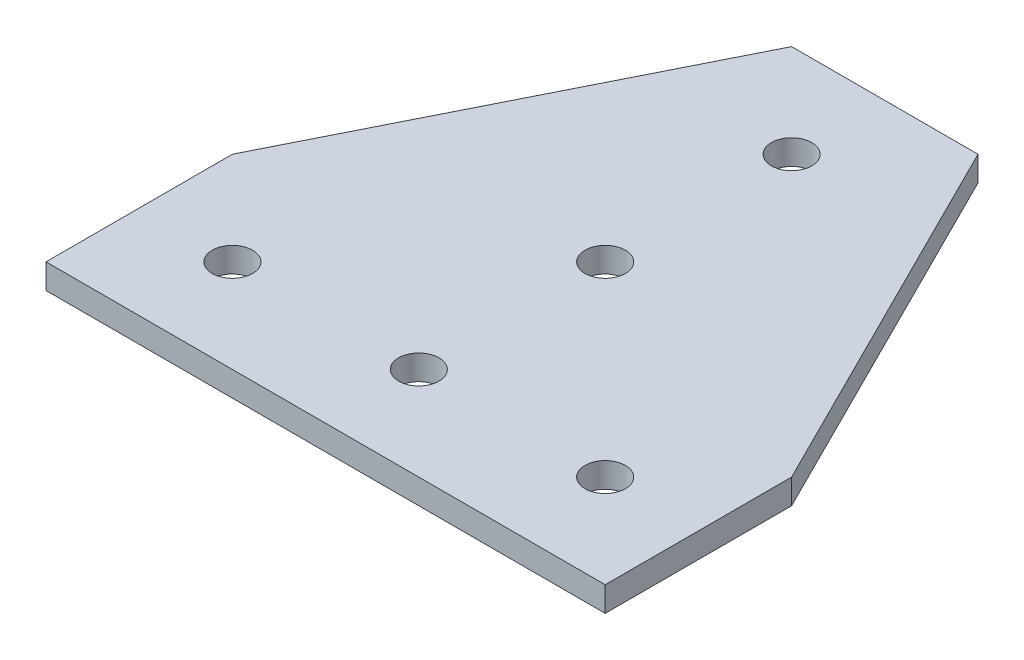
ISO-10303-21;
HEADER;
FILE_DESCRIPTION(('STEP AP214'),'2;1');
FILE_NAME('part.step','',(''),(''),'','','');
FILE_SCHEMA(('AUTOMOTIVE_DESIGN { 1 0 10303 214 1 1 1 1 }'));
ENDSEC;
DATA;
#1=APPLICATION_CONTEXT('core data for automotive mechanical design processes');
#2=APPLICATION_PROTOCOL_DEFINITION('international standard','automotive_design',2000,#1);
#3=PRODUCT_CONTEXT('',#1,'mechanical');
#4=PRODUCT('Part','Part','',(#3));
#5=PRODUCT_RELATED_PRODUCT_CATEGORY('part','',(#4));
#6=PRODUCT_DEFINITION_FORMATION('','',#4);
#7=PRODUCT_DEFINITION_CONTEXT('part definition',#1,'design');
#8=PRODUCT_DEFINITION('design','',#6,#7);
#9=PRODUCT_DEFINITION_SHAPE('','',#8);
#10=(LENGTH_UNIT() NAMED_UNIT(*) SI_UNIT(.MILLI.,.METRE.));
#11=(NAMED_UNIT(*) PLANE_ANGLE_UNIT() SI_UNIT($,.RADIAN.));
#12=(NAMED_UNIT(*) SI_UNIT($,.STERADIAN.) SOLID_ANGLE_UNIT());
#13=UNCERTAINTY_MEASURE_WITH_UNIT(LENGTH_MEASURE(1.E-05),#10,'distance_accuracy_value','');
#14=(GEOMETRIC_REPRESENTATION_CONTEXT(3) GLOBAL_UNCERTAINTY_ASSIGNED_CONTEXT((#13)) GLOBAL_UNIT_ASSIGNED_CONTEXT((#10,
#11,#12)) REPRESENTATION_CONTEXT('',''));
#15=CARTESIAN_POINT('',(0.,0.,0.));
#16=DIRECTION('',(0.,0.,1.));
#17=DIRECTION('',(1.,0.,0.));
#18=AXIS2_PLACEMENT_3D('',#15,#16,#17);
#19=CARTESIAN_POINT('',(45.,4.,0.));
#20=DIRECTION('',(-1.,0.,0.));
#21=DIRECTION('',(0.,0.,1.));
#22=AXIS2_PLACEMENT_3D('',#19,#20,#21);
#23=PLANE('',#22);
#24=DIRECTION('',(0.,0.,-1.));
#25=VECTOR('',#24,1.);
#26=CARTESIAN_POINT('',(45.,0.,0.));
#27=LINE('',#26,#25);
#28=CARTESIAN_POINT('',(45.,0.,0.));
#29=VERTEX_POINT('',#28);
#30=CARTESIAN_POINT('',(45.,0.,-30.));
#31=VERTEX_POINT('',#30);
#32=EDGE_CURVE('E123',#29,#31,#27,.T.);
#33=ORIENTED_EDGE('',*,*,#32,.T.);
#34=DIRECTION('',(0.,-1.,0.));
#35=VECTOR('',#34,1.);
#36=CARTESIAN_POINT('',(45.,4.,-30.));
#37=LINE('',#36,#35);
#38=CARTESIAN_POINT('',(45.,4.,-30.));
#39=VERTEX_POINT('',#38);
#40=EDGE_CURVE('E11',#39,#31,#37,.T.);
#41=ORIENTED_EDGE('',*,*,#40,.F.);
#42=DIRECTION('',(0.,0.,-1.));
#43=VECTOR('',#42,1.);
#44=CARTESIAN_POINT('',(45.,4.,0.));
#45=LINE('',#44,#43);
#46=CARTESIAN_POINT('',(45.,4.,0.));
#47=VERTEX_POINT('',#46);
#48=EDGE_CURVE('E134',#47,#39,#45,.T.);
#49=ORIENTED_EDGE('',*,*,#48,.F.);
#50=DIRECTION('',(0.,-1.,0.));
#51=VECTOR('',#50,1.);
#52=CARTESIAN_POINT('',(45.,4.,0.));
#53=LINE('',#52,#51);
#54=EDGE_CURVE('E119',#47,#29,#53,.T.);
#55=ORIENTED_EDGE('',*,*,#54,.T.);
#56=EDGE_LOOP('',(#33,#41,#49,#55));
#57=FACE_BOUND('',#56,.T.);
#58=ADVANCED_FACE('F39',(#57),#23,.F.);
#59=CARTESIAN_POINT('',(45.,4.,-30.));
#60=DIRECTION('',(-0.894427190999916,0.,0.447213595499958));
#61=DIRECTION('',(0.447213595499958,0.,0.894427190999916));
#62=AXIS2_PLACEMENT_3D('',#59,#60,#61);
#63=PLANE('',#62);
#64=DIRECTION('',(-0.447213595499958,0.,-0.894427190999916));
#65=VECTOR('',#64,1.);
#66=CARTESIAN_POINT('',(45.,0.,-30.));
#67=LINE('',#66,#65);
#68=CARTESIAN_POINT('',(15.,0.,-90.));
#69=VERTEX_POINT('',#68);
#70=EDGE_CURVE('E126',#31,#69,#67,.T.);
#71=ORIENTED_EDGE('',*,*,#70,.T.);
#72=DIRECTION('',(0.,-1.,0.));
#73=VECTOR('',#72,1.);
#74=CARTESIAN_POINT('',(15.,4.,-90.));
#75=LINE('',#74,#73);
#76=CARTESIAN_POINT('',(15.,4.,-90.));
#77=VERTEX_POINT('',#76);
#78=EDGE_CURVE('E47',#77,#69,#75,.T.);
#79=ORIENTED_EDGE('',*,*,#78,.F.);
#80=DIRECTION('',(-0.447213595499958,0.,-0.894427190999916));
#81=VECTOR('',#80,1.);
#82=CARTESIAN_POINT('',(45.,4.,-30.));
#83=LINE('',#82,#81);
#84=EDGE_CURVE('E92',#39,#77,#83,.T.);
#85=ORIENTED_EDGE('',*,*,#84,.F.);
#86=ORIENTED_EDGE('',*,*,#40,.T.);
#87=EDGE_LOOP('',(#71,#79,#85,#86));
#88=FACE_BOUND('',#87,.T.);
#89=ADVANCED_FACE('F159',(#88),#63,.F.);
#90=CARTESIAN_POINT('',(-15.,4.,-90.));
#91=DIRECTION('',(0.,0.,1.));
#92=DIRECTION('',(1.,0.,0.));
#93=AXIS2_PLACEMENT_3D('',#90,#91,#92);
#94=PLANE('',#93);
#95=DIRECTION('',(-1.,0.,0.));
#96=VECTOR('',#95,1.);
#97=CARTESIAN_POINT('',(-15.,0.,-90.));
#98=LINE('',#97,#96);
#99=CARTESIAN_POINT('',(-15.,0.,-90.));
#100=VERTEX_POINT('',#99);
#101=EDGE_CURVE('E129',#69,#100,#98,.T.);
#102=ORIENTED_EDGE('',*,*,#101,.T.);
#103=DIRECTION('',(0.,-1.,0.));
#104=VECTOR('',#103,1.);
#105=CARTESIAN_POINT('',(-15.,4.,-90.));
#106=LINE('',#105,#104);
#107=CARTESIAN_POINT('',(-15.,4.,-90.));
#108=VERTEX_POINT('',#107);
#109=EDGE_CURVE('E114',#108,#100,#106,.T.);
#110=ORIENTED_EDGE('',*,*,#109,.F.);
#111=DIRECTION('',(-1.,0.,0.));
#112=VECTOR('',#111,1.);
#113=CARTESIAN_POINT('',(-15.,4.,-90.));
#114=LINE('',#113,#112);
#115=EDGE_CURVE('E105',#77,#108,#114,.T.);
#116=ORIENTED_EDGE('',*,*,#115,.F.);
#117=ORIENTED_EDGE('',*,*,#78,.T.);
#118=EDGE_LOOP('',(#102,#110,#116,#117));
#119=FACE_BOUND('',#118,.T.);
#120=ADVANCED_FACE('F140',(#119),#94,.F.);
#121=CARTESIAN_POINT('',(-45.,4.,-30.));
#122=DIRECTION('',(0.894427190999916,0.,0.447213595499958));
#123=DIRECTION('',(0.447213595499958,0.,-0.894427190999916));
#124=AXIS2_PLACEMENT_3D('',#121,#122,#123);
#125=PLANE('',#124);
#126=DIRECTION('',(-0.447213595499958,0.,0.894427190999916));
#127=VECTOR('',#126,1.);
#128=CARTESIAN_POINT('',(-45.,0.,-30.));
#129=LINE('',#128,#127);
#130=CARTESIAN_POINT('',(-45.,0.,-30.));
#131=VERTEX_POINT('',#130);
#132=EDGE_CURVE('E113',#100,#131,#129,.T.);
#133=ORIENTED_EDGE('',*,*,#132,.T.);
#134=DIRECTION('',(0.,-1.,0.));
#135=VECTOR('',#134,1.);
#136=CARTESIAN_POINT('',(-45.,4.,-30.));
#137=LINE('',#136,#135);
#138=CARTESIAN_POINT('',(-45.,4.,-30.));
#139=VERTEX_POINT('',#138);
#140=EDGE_CURVE('E110',#139,#131,#137,.T.);
#141=ORIENTED_EDGE('',*,*,#140,.F.);
#142=DIRECTION('',(-0.447213595499958,0.,0.894427190999916));
#143=VECTOR('',#142,1.);
#144=CARTESIAN_POINT('',(-45.,4.,-30.));
#145=LINE('',#144,#143);
#146=EDGE_CURVE('E99',#108,#139,#145,.T.);
#147=ORIENTED_EDGE('',*,*,#146,.F.);
#148=ORIENTED_EDGE('',*,*,#109,.T.);
#149=EDGE_LOOP('',(#133,#141,#147,#148));
#150=FACE_BOUND('',#149,.T.);
#151=ADVANCED_FACE('F111',(#150),#125,.F.);
#152=CARTESIAN_POINT('',(-45.,4.,0.));
#153=DIRECTION('',(1.,0.,0.));
#154=DIRECTION('',(0.,0.,-1.));
#155=AXIS2_PLACEMENT_3D('',#152,#153,#154);
#156=PLANE('',#155);
#157=DIRECTION('',(0.,0.,1.));
#158=VECTOR('',#157,1.);
#159=CARTESIAN_POINT('',(-45.,0.,0.));
#160=LINE('',#159,#158);
#161=CARTESIAN_POINT('',(-45.,0.,0.));
#162=VERTEX_POINT('',#161);
#163=EDGE_CURVE('E78',#131,#162,#160,.T.);
#164=ORIENTED_EDGE('',*,*,#163,.T.);
#165=DIRECTION('',(0.,-1.,0.));
#166=VECTOR('',#165,1.);
#167=CARTESIAN_POINT('',(-45.,4.,0.));
#168=LINE('',#167,#166);
#169=CARTESIAN_POINT('',(-45.,4.,0.));
#170=VERTEX_POINT('',#169);
#171=EDGE_CURVE('E115',#170,#162,#168,.T.);
#172=ORIENTED_EDGE('',*,*,#171,.F.);
#173=DIRECTION('',(0.,0.,1.));
#174=VECTOR('',#173,1.);
#175=CARTESIAN_POINT('',(-45.,4.,0.));
#176=LINE('',#175,#174);
#177=EDGE_CURVE('E103',#139,#170,#176,.T.);
#178=ORIENTED_EDGE('',*,*,#177,.F.);
#179=ORIENTED_EDGE('',*,*,#140,.T.);
#180=EDGE_LOOP('',(#164,#172,#178,#179));
#181=FACE_BOUND('',#180,.T.);
#182=ADVANCED_FACE('F117',(#181),#156,.F.);
#183=CARTESIAN_POINT('',(-45.,4.,0.));
#184=DIRECTION('',(0.,0.,-1.));
#185=DIRECTION('',(-1.,0.,0.));
#186=AXIS2_PLACEMENT_3D('',#183,#184,#185);
#187=PLANE('',#186);
#188=DIRECTION('',(1.,0.,0.));
#189=VECTOR('',#188,1.);
#190=CARTESIAN_POINT('',(-45.,0.,0.));
#191=LINE('',#190,#189);
#192=EDGE_CURVE('E84',#162,#29,#191,.T.);
#193=ORIENTED_EDGE('',*,*,#192,.T.);
#194=ORIENTED_EDGE('',*,*,#54,.F.);
#195=DIRECTION('',(1.,0.,0.));
#196=VECTOR('',#195,1.);
#197=CARTESIAN_POINT('',(-45.,4.,0.));
#198=LINE('',#197,#196);
#199=EDGE_CURVE('E55',#170,#47,#198,.T.);
#200=ORIENTED_EDGE('',*,*,#199,.F.);
#201=ORIENTED_EDGE('',*,*,#171,.T.);
#202=EDGE_LOOP('',(#193,#194,#200,#201));
#203=FACE_BOUND('',#202,.T.);
#204=ADVANCED_FACE('F147',(#203),#187,.F.);
#205=CARTESIAN_POINT('',(0.,4.,0.));
#206=DIRECTION('',(0.,-1.,0.));
#207=DIRECTION('',(0.,0.,-1.));
#208=AXIS2_PLACEMENT_3D('',#205,#206,#207);
#209=PLANE('',#208);
#210=CARTESIAN_POINT('',(0.,4.,-75.));
#211=DIRECTION('',(0.,1.,0.));
#212=DIRECTION('',(0.,0.,1.));
#213=AXIS2_PLACEMENT_3D('',#210,#211,#212);
#214=CIRCLE('',#213,3.25);
#215=CARTESIAN_POINT('',(0.,4.,-71.75));
#216=VERTEX_POINT('',#215);
#217=EDGE_CURVE('E255',#216,#216,#214,.T.);
#218=ORIENTED_EDGE('',*,*,#217,.F.);
#219=EDGE_LOOP('',(#218));
#220=FACE_BOUND('',#219,.T.);
#221=CARTESIAN_POINT('',(30.0000000000006,4.,-15.));
#222=DIRECTION('',(0.,1.,0.));
#223=DIRECTION('',(0.,0.,1.));
#224=AXIS2_PLACEMENT_3D('',#221,#222,#223);
#225=CIRCLE('',#224,3.25);
#226=CARTESIAN_POINT('',(30.0000000000006,4.,-11.75));
#227=VERTEX_POINT('',#226);
#228=EDGE_CURVE('E270',#227,#227,#225,.T.);
#229=ORIENTED_EDGE('',*,*,#228,.F.);
#230=EDGE_LOOP('',(#229));
#231=FACE_BOUND('',#230,.T.);
#232=CARTESIAN_POINT('',(-29.9999999999994,4.,-14.9999999999998));
#233=DIRECTION('',(0.,1.,0.));
#234=DIRECTION('',(0.,0.,1.));
#235=AXIS2_PLACEMENT_3D('',#232,#233,#234);
#236=CIRCLE('',#235,3.25);
#237=CARTESIAN_POINT('',(-29.9999999999994,4.,-11.7499999999998));
#238=VERTEX_POINT('',#237);
#239=EDGE_CURVE('E263',#238,#238,#236,.T.);
#240=ORIENTED_EDGE('',*,*,#239,.F.);
#241=EDGE_LOOP('',(#240));
#242=FACE_BOUND('',#241,.T.);
#243=CARTESIAN_POINT('',(6.24792700594322E-13,4.,-15.));
#244=DIRECTION('',(0.,1.,0.));
#245=DIRECTION('',(0.,0.,1.));
#246=AXIS2_PLACEMENT_3D('',#243,#244,#245);
#247=CIRCLE('',#246,3.25);
#248=CARTESIAN_POINT('',(6.24792700594322E-13,4.,-11.75));
#249=VERTEX_POINT('',#248);
#250=EDGE_CURVE('E278',#249,#249,#247,.T.);
#251=ORIENTED_EDGE('',*,*,#250,.F.);
#252=EDGE_LOOP('',(#251));
#253=FACE_BOUND('',#252,.T.);
#254=CARTESIAN_POINT('',(3.12396350297161E-13,4.,-45.));
#255=DIRECTION('',(0.,1.,0.));
#256=DIRECTION('',(0.,0.,1.));
#257=AXIS2_PLACEMENT_3D('',#254,#255,#256);
#258=CIRCLE('',#257,3.25);
#259=CARTESIAN_POINT('',(3.12396350297161E-13,4.,-41.75));
#260=VERTEX_POINT('',#259);
#261=EDGE_CURVE('E256',#260,#260,#258,.T.);
#262=ORIENTED_EDGE('',*,*,#261,.F.);
#263=EDGE_LOOP('',(#262));
#264=FACE_BOUND('',#263,.T.);
#265=ORIENTED_EDGE('',*,*,#48,.T.);
#266=ORIENTED_EDGE('',*,*,#84,.T.);
#267=ORIENTED_EDGE('',*,*,#115,.T.);
#268=ORIENTED_EDGE('',*,*,#146,.T.);
#269=ORIENTED_EDGE('',*,*,#177,.T.);
#270=ORIENTED_EDGE('',*,*,#199,.T.);
#271=EDGE_LOOP('',(#265,#266,#267,#268,#269,#270));
#272=FACE_BOUND('',#271,.T.);
#273=ADVANCED_FACE('F101',(#220,#231,#242,#253,#264,#272),#209,.F.);
#274=CARTESIAN_POINT('',(0.,0.,0.));
#275=DIRECTION('',(0.,-1.,0.));
#276=DIRECTION('',(0.,0.,-1.));
#277=AXIS2_PLACEMENT_3D('',#274,#275,#276);
#278=PLANE('',#277);
#279=CARTESIAN_POINT('',(0.,0.,-75.));
#280=DIRECTION('',(0.,1.,0.));
#281=DIRECTION('',(0.,0.,1.));
#282=AXIS2_PLACEMENT_3D('',#279,#280,#281);
#283=CIRCLE('',#282,3.25);
#284=CARTESIAN_POINT('',(0.,0.,-71.75));
#285=VERTEX_POINT('',#284);
#286=EDGE_CURVE('E127',#285,#285,#283,.T.);
#287=ORIENTED_EDGE('',*,*,#286,.T.);
#288=EDGE_LOOP('',(#287));
#289=FACE_BOUND('',#288,.T.);
#290=CARTESIAN_POINT('',(30.0000000000006,0.,-15.));
#291=DIRECTION('',(0.,1.,0.));
#292=DIRECTION('',(0.,0.,1.));
#293=AXIS2_PLACEMENT_3D('',#290,#291,#292);
#294=CIRCLE('',#293,3.25);
#295=CARTESIAN_POINT('',(30.0000000000006,0.,-11.75));
#296=VERTEX_POINT('',#295);
#297=EDGE_CURVE('E273',#296,#296,#294,.T.);
#298=ORIENTED_EDGE('',*,*,#297,.T.);
#299=EDGE_LOOP('',(#298));
#300=FACE_BOUND('',#299,.T.);
#301=CARTESIAN_POINT('',(-29.9999999999994,0.,-14.9999999999998));
#302=DIRECTION('',(0.,1.,0.));
#303=DIRECTION('',(0.,0.,1.));
#304=AXIS2_PLACEMENT_3D('',#301,#302,#303);
#305=CIRCLE('',#304,3.25);
#306=CARTESIAN_POINT('',(-29.9999999999994,0.,-11.7499999999998));
#307=VERTEX_POINT('',#306);
#308=EDGE_CURVE('E267',#307,#307,#305,.T.);
#309=ORIENTED_EDGE('',*,*,#308,.T.);
#310=EDGE_LOOP('',(#309));
#311=FACE_BOUND('',#310,.T.);
#312=CARTESIAN_POINT('',(6.24792700594322E-13,0.,-15.));
#313=DIRECTION('',(0.,1.,0.));
#314=DIRECTION('',(0.,0.,1.));
#315=AXIS2_PLACEMENT_3D('',#312,#313,#314);
#316=CIRCLE('',#315,3.25);
#317=CARTESIAN_POINT('',(6.24792700594322E-13,0.,-11.75));
#318=VERTEX_POINT('',#317);
#319=EDGE_CURVE('E266',#318,#318,#316,.T.);
#320=ORIENTED_EDGE('',*,*,#319,.T.);
#321=EDGE_LOOP('',(#320));
#322=FACE_BOUND('',#321,.T.);
#323=CARTESIAN_POINT('',(3.12396350297161E-13,0.,-45.));
#324=DIRECTION('',(0.,1.,0.));
#325=DIRECTION('',(0.,0.,1.));
#326=AXIS2_PLACEMENT_3D('',#323,#324,#325);
#327=CIRCLE('',#326,3.25);
#328=CARTESIAN_POINT('',(3.12396350297161E-13,0.,-41.75));
#329=VERTEX_POINT('',#328);
#330=EDGE_CURVE('E260',#329,#329,#327,.T.);
#331=ORIENTED_EDGE('',*,*,#330,.T.);
#332=EDGE_LOOP('',(#331));
#333=FACE_BOUND('',#332,.T.);
#334=ORIENTED_EDGE('',*,*,#32,.F.);
#335=ORIENTED_EDGE('',*,*,#192,.F.);
#336=ORIENTED_EDGE('',*,*,#163,.F.);
#337=ORIENTED_EDGE('',*,*,#132,.F.);
#338=ORIENTED_EDGE('',*,*,#101,.F.);
#339=ORIENTED_EDGE('',*,*,#70,.F.);
#340=EDGE_LOOP('',(#334,#335,#336,#337,#338,#339));
#341=FACE_BOUND('',#340,.T.);
#342=ADVANCED_FACE('F143',(#289,#300,#311,#322,#333,#341),#278,.T.);
#343=CARTESIAN_POINT('',(3.12396350297161E-13,0.,-45.));
#344=DIRECTION('',(0.,1.,0.));
#345=DIRECTION('',(0.,0.,1.));
#346=AXIS2_PLACEMENT_3D('',#343,#344,#345);
#347=CYLINDRICAL_SURFACE('',#346,3.25);
#348=ORIENTED_EDGE('',*,*,#330,.F.);
#349=EDGE_LOOP('',(#348));
#350=FACE_BOUND('',#349,.T.);
#351=ORIENTED_EDGE('',*,*,#261,.T.);
#352=EDGE_LOOP('',(#351));
#353=FACE_BOUND('',#352,.T.);
#354=ADVANCED_FACE('F198',(#350,#353),#347,.F.);
#355=CARTESIAN_POINT('',(6.24792700594322E-13,0.,-15.));
#356=DIRECTION('',(0.,1.,0.));
#357=DIRECTION('',(0.,0.,1.));
#358=AXIS2_PLACEMENT_3D('',#355,#356,#357);
#359=CYLINDRICAL_SURFACE('',#358,3.25);
#360=ORIENTED_EDGE('',*,*,#319,.F.);
#361=EDGE_LOOP('',(#360));
#362=FACE_BOUND('',#361,.T.);
#363=ORIENTED_EDGE('',*,*,#250,.T.);
#364=EDGE_LOOP('',(#363));
#365=FACE_BOUND('',#364,.T.);
#366=ADVANCED_FACE('F207',(#362,#365),#359,.F.);
#367=CARTESIAN_POINT('',(-29.9999999999994,0.,-14.9999999999998));
#368=DIRECTION('',(0.,1.,0.));
#369=DIRECTION('',(0.,0.,1.));
#370=AXIS2_PLACEMENT_3D('',#367,#368,#369);
#371=CYLINDRICAL_SURFACE('',#370,3.25);
#372=ORIENTED_EDGE('',*,*,#308,.F.);
#373=EDGE_LOOP('',(#372));
#374=FACE_BOUND('',#373,.T.);
#375=ORIENTED_EDGE('',*,*,#239,.T.);
#376=EDGE_LOOP('',(#375));
#377=FACE_BOUND('',#376,.T.);
#378=ADVANCED_FACE('F217',(#374,#377),#371,.F.);
#379=CARTESIAN_POINT('',(30.0000000000006,0.,-15.));
#380=DIRECTION('',(0.,1.,0.));
#381=DIRECTION('',(0.,0.,1.));
#382=AXIS2_PLACEMENT_3D('',#379,#380,#381);
#383=CYLINDRICAL_SURFACE('',#382,3.25);
#384=ORIENTED_EDGE('',*,*,#297,.F.);
#385=EDGE_LOOP('',(#384));
#386=FACE_BOUND('',#385,.T.);
#387=ORIENTED_EDGE('',*,*,#228,.T.);
#388=EDGE_LOOP('',(#387));
#389=FACE_BOUND('',#388,.T.);
#390=ADVANCED_FACE('F227',(#386,#389),#383,.F.);
#391=CARTESIAN_POINT('',(0.,0.,-75.));
#392=DIRECTION('',(0.,1.,0.));
#393=DIRECTION('',(0.,0.,1.));
#394=AXIS2_PLACEMENT_3D('',#391,#392,#393);
#395=CYLINDRICAL_SURFACE('',#394,3.25);
#396=ORIENTED_EDGE('',*,*,#286,.F.);
#397=EDGE_LOOP('',(#396));
#398=FACE_BOUND('',#397,.T.);
#399=ORIENTED_EDGE('',*,*,#217,.T.);
#400=EDGE_LOOP('',(#399));
#401=FACE_BOUND('',#400,.T.);
#402=ADVANCED_FACE('F237',(#398,#401),#395,.F.);
#403=CLOSED_SHELL('',(#58,#89,#120,#151,#182,#204,#273,#342,#354,#366,#378,#390,#402));
#404=MANIFOLD_SOLID_BREP('B2',#403);
#405=ADVANCED_BREP_SHAPE_REPRESENTATION('',(#18,#404),#14);
#406=SHAPE_DEFINITION_REPRESENTATION(#9,#405);
ENDSEC;
END-ISO-10303-21;
